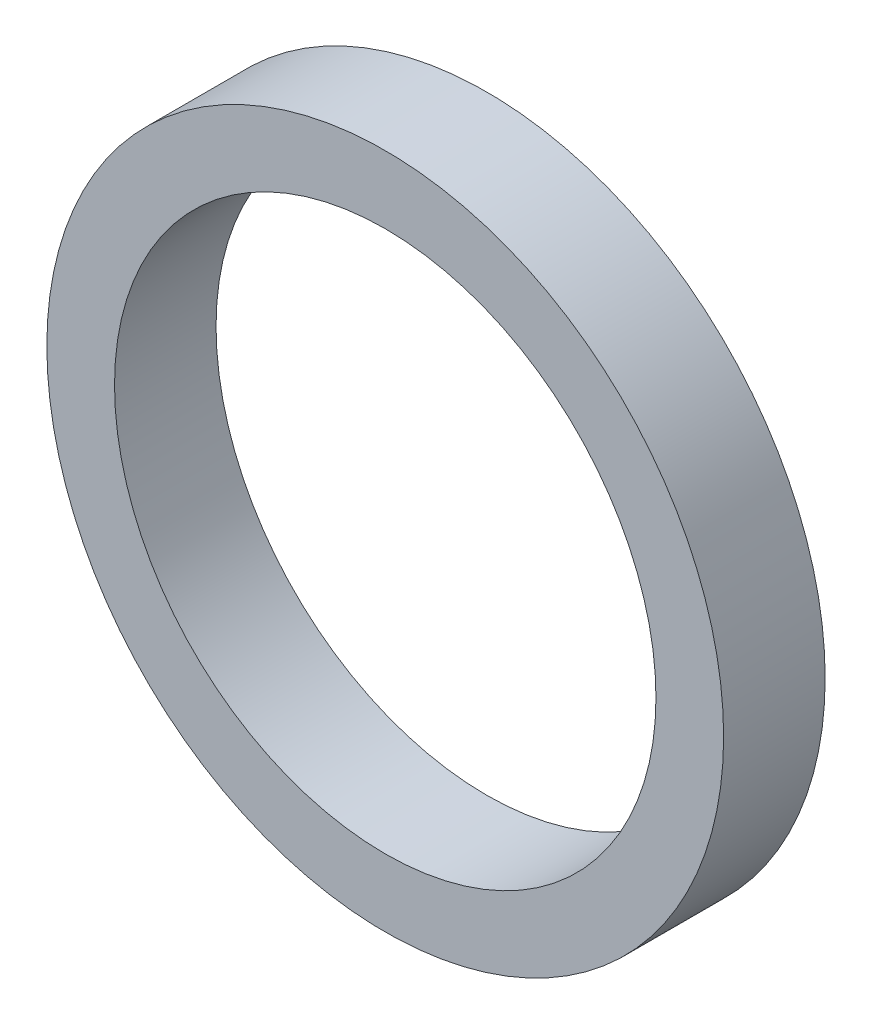
ISO-10303-21;
HEADER;
FILE_DESCRIPTION(('STEP AP214'),'2;1');
FILE_NAME('part.step','',(''),(''),'','','');
FILE_SCHEMA(('AUTOMOTIVE_DESIGN { 1 0 10303 214 1 1 1 1 }'));
ENDSEC;
DATA;
#1=APPLICATION_CONTEXT('core data for automotive mechanical design processes');
#2=APPLICATION_PROTOCOL_DEFINITION('international standard','automotive_design',2000,#1);
#3=PRODUCT_CONTEXT('',#1,'mechanical');
#4=PRODUCT('Part','Part','',(#3));
#5=PRODUCT_RELATED_PRODUCT_CATEGORY('part','',(#4));
#6=PRODUCT_DEFINITION_FORMATION('','',#4);
#7=PRODUCT_DEFINITION_CONTEXT('part definition',#1,'design');
#8=PRODUCT_DEFINITION('design','',#6,#7);
#9=PRODUCT_DEFINITION_SHAPE('','',#8);
#10=(LENGTH_UNIT() NAMED_UNIT(*) SI_UNIT(.MILLI.,.METRE.));
#11=(NAMED_UNIT(*) PLANE_ANGLE_UNIT() SI_UNIT($,.RADIAN.));
#12=(NAMED_UNIT(*) SI_UNIT($,.STERADIAN.) SOLID_ANGLE_UNIT());
#13=UNCERTAINTY_MEASURE_WITH_UNIT(LENGTH_MEASURE(1.E-05),#10,'distance_accuracy_value','');
#14=(GEOMETRIC_REPRESENTATION_CONTEXT(3) GLOBAL_UNCERTAINTY_ASSIGNED_CONTEXT((#13)) GLOBAL_UNIT_ASSIGNED_CONTEXT((#10,
#11,#12)) REPRESENTATION_CONTEXT('',''));
#15=CARTESIAN_POINT('',(0.,0.,0.));
#16=DIRECTION('',(0.,0.,1.));
#17=DIRECTION('',(1.,0.,0.));
#18=AXIS2_PLACEMENT_3D('',#15,#16,#17);
#19=CARTESIAN_POINT('',(0.,0.,3.));
#20=DIRECTION('',(0.,0.,1.));
#21=DIRECTION('',(1.,0.,0.));
#22=AXIS2_PLACEMENT_3D('',#19,#20,#21);
#23=PLANE('',#22);
#24=CARTESIAN_POINT('',(0.,0.,3.));
#25=DIRECTION('',(0.,0.,1.));
#26=DIRECTION('',(1.,0.,0.));
#27=AXIS2_PLACEMENT_3D('',#24,#25,#26);
#28=CIRCLE('',#27,10.);
#29=CARTESIAN_POINT('',(10.,0.,3.));
#30=VERTEX_POINT('',#29);
#31=EDGE_CURVE('E10',#30,#30,#28,.T.);
#32=ORIENTED_EDGE('',*,*,#31,.T.);
#33=EDGE_LOOP('',(#32));
#34=FACE_BOUND('',#33,.T.);
#35=CARTESIAN_POINT('',(0.,0.,3.));
#36=DIRECTION('',(0.,0.,1.));
#37=DIRECTION('',(1.,0.,0.));
#38=AXIS2_PLACEMENT_3D('',#35,#36,#37);
#39=CIRCLE('',#38,8.);
#40=CARTESIAN_POINT('',(8.,0.,3.));
#41=VERTEX_POINT('',#40);
#42=EDGE_CURVE('E54',#41,#41,#39,.T.);
#43=ORIENTED_EDGE('',*,*,#42,.F.);
#44=EDGE_LOOP('',(#43));
#45=FACE_BOUND('',#44,.T.);
#46=ADVANCED_FACE('F41',(#34,#45),#23,.T.);
#47=CARTESIAN_POINT('',(0.,0.,0.));
#48=DIRECTION('',(0.,0.,1.));
#49=DIRECTION('',(1.,0.,0.));
#50=AXIS2_PLACEMENT_3D('',#47,#48,#49);
#51=PLANE('',#50);
#52=CARTESIAN_POINT('',(0.,0.,0.));
#53=DIRECTION('',(0.,0.,1.));
#54=DIRECTION('',(1.,0.,0.));
#55=AXIS2_PLACEMENT_3D('',#52,#53,#54);
#56=CIRCLE('',#55,10.);
#57=CARTESIAN_POINT('',(10.,0.,0.));
#58=VERTEX_POINT('',#57);
#59=EDGE_CURVE('E45',#58,#58,#56,.T.);
#60=ORIENTED_EDGE('',*,*,#59,.F.);
#61=EDGE_LOOP('',(#60));
#62=FACE_BOUND('',#61,.T.);
#63=CARTESIAN_POINT('',(0.,0.,0.));
#64=DIRECTION('',(0.,0.,1.));
#65=DIRECTION('',(1.,0.,0.));
#66=AXIS2_PLACEMENT_3D('',#63,#64,#65);
#67=CIRCLE('',#66,8.);
#68=CARTESIAN_POINT('',(8.,0.,0.));
#69=VERTEX_POINT('',#68);
#70=EDGE_CURVE('E56',#69,#69,#67,.T.);
#71=ORIENTED_EDGE('',*,*,#70,.T.);
#72=EDGE_LOOP('',(#71));
#73=FACE_BOUND('',#72,.T.);
#74=ADVANCED_FACE('F68',(#62,#73),#51,.F.);
#75=CARTESIAN_POINT('',(0.,0.,3.));
#76=DIRECTION('',(0.,0.,-1.));
#77=DIRECTION('',(-1.,0.,0.));
#78=AXIS2_PLACEMENT_3D('',#75,#76,#77);
#79=CYLINDRICAL_SURFACE('',#78,10.);
#80=ORIENTED_EDGE('',*,*,#31,.F.);
#81=EDGE_LOOP('',(#80));
#82=FACE_BOUND('',#81,.T.);
#83=ORIENTED_EDGE('',*,*,#59,.T.);
#84=EDGE_LOOP('',(#83));
#85=FACE_BOUND('',#84,.T.);
#86=ADVANCED_FACE('F43',(#82,#85),#79,.T.);
#87=CARTESIAN_POINT('',(0.,0.,3.));
#88=DIRECTION('',(0.,0.,-1.));
#89=DIRECTION('',(-1.,0.,0.));
#90=AXIS2_PLACEMENT_3D('',#87,#88,#89);
#91=CYLINDRICAL_SURFACE('',#90,8.);
#92=ORIENTED_EDGE('',*,*,#42,.T.);
#93=EDGE_LOOP('',(#92));
#94=FACE_BOUND('',#93,.T.);
#95=ORIENTED_EDGE('',*,*,#70,.F.);
#96=EDGE_LOOP('',(#95));
#97=FACE_BOUND('',#96,.T.);
#98=ADVANCED_FACE('F64',(#94,#97),#91,.F.);
#99=CLOSED_SHELL('',(#46,#74,#86,#98));
#100=MANIFOLD_SOLID_BREP('B2',#99);
#101=ADVANCED_BREP_SHAPE_REPRESENTATION('',(#18,#100),#14);
#102=SHAPE_DEFINITION_REPRESENTATION(#9,#101);
ENDSEC;
END-ISO-10303-21;
